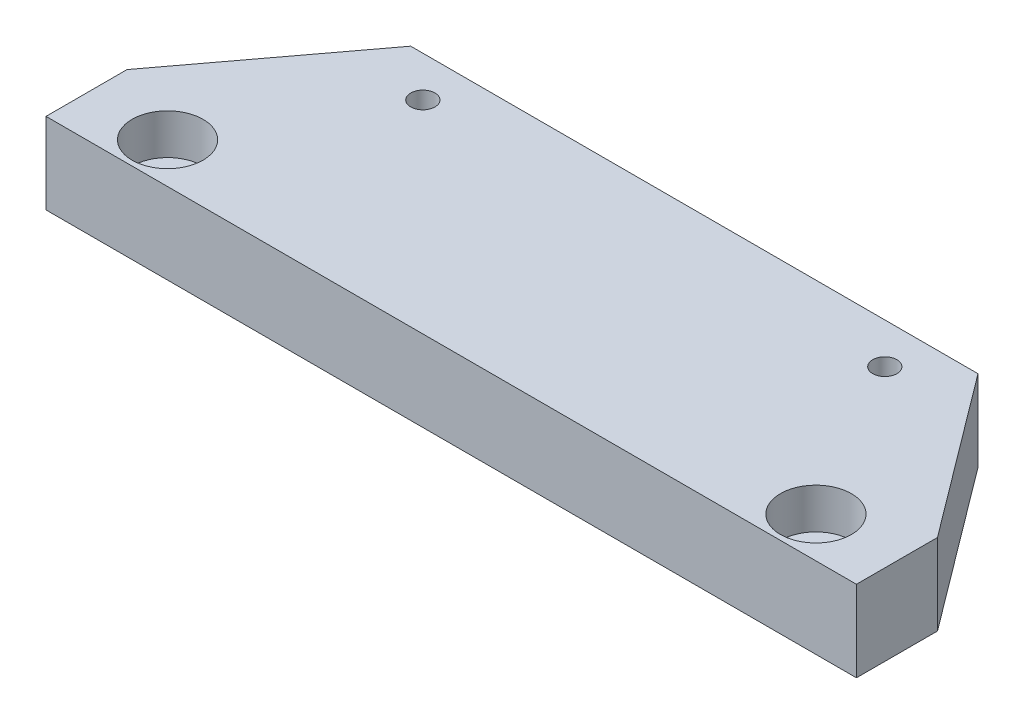
ISO-10303-21;
HEADER;
FILE_DESCRIPTION(('STEP AP214'),'2;1');
FILE_NAME('part.step','',(''),(''),'','','');
FILE_SCHEMA(('AUTOMOTIVE_DESIGN { 1 0 10303 214 1 1 1 1 }'));
ENDSEC;
DATA;
#1=APPLICATION_CONTEXT('core data for automotive mechanical design processes');
#2=APPLICATION_PROTOCOL_DEFINITION('international standard','automotive_design',2000,#1);
#3=PRODUCT_CONTEXT('',#1,'mechanical');
#4=PRODUCT('Part','Part','',(#3));
#5=PRODUCT_RELATED_PRODUCT_CATEGORY('part','',(#4));
#6=PRODUCT_DEFINITION_FORMATION('','',#4);
#7=PRODUCT_DEFINITION_CONTEXT('part definition',#1,'design');
#8=PRODUCT_DEFINITION('design','',#6,#7);
#9=PRODUCT_DEFINITION_SHAPE('','',#8);
#10=(LENGTH_UNIT() NAMED_UNIT(*) SI_UNIT(.MILLI.,.METRE.));
#11=(NAMED_UNIT(*) PLANE_ANGLE_UNIT() SI_UNIT($,.RADIAN.));
#12=(NAMED_UNIT(*) SI_UNIT($,.STERADIAN.) SOLID_ANGLE_UNIT());
#13=UNCERTAINTY_MEASURE_WITH_UNIT(LENGTH_MEASURE(1.E-05),#10,'distance_accuracy_value','');
#14=(GEOMETRIC_REPRESENTATION_CONTEXT(3) GLOBAL_UNCERTAINTY_ASSIGNED_CONTEXT((#13)) GLOBAL_UNIT_ASSIGNED_CONTEXT((#10,
#11,#12)) REPRESENTATION_CONTEXT('',''));
#15=CARTESIAN_POINT('',(0.,0.,0.));
#16=DIRECTION('',(0.,0.,1.));
#17=DIRECTION('',(1.,0.,0.));
#18=AXIS2_PLACEMENT_3D('',#15,#16,#17);
#19=CARTESIAN_POINT('',(56.8959999999999,12.7,-42.672));
#20=DIRECTION('',(0.799999999999999,0.,-0.600000000000001));
#21=DIRECTION('',(-0.600000000000001,0.,-0.8));
#22=AXIS2_PLACEMENT_3D('',#19,#20,#21);
#23=PLANE('',#22);
#24=DIRECTION('',(0.600000000000001,0.,0.8));
#25=VECTOR('',#24,1.);
#26=CARTESIAN_POINT('',(56.8959999999999,0.,-42.672));
#27=LINE('',#26,#25);
#28=CARTESIAN_POINT('',(88.9,0.,0.));
#29=VERTEX_POINT('',#28);
#30=CARTESIAN_POINT('',(107.95,0.,25.4));
#31=VERTEX_POINT('',#30);
#32=EDGE_CURVE('E169',#29,#31,#27,.T.);
#33=ORIENTED_EDGE('',*,*,#32,.F.);
#34=DIRECTION('',(0.,-1.,0.));
#35=VECTOR('',#34,1.);
#36=CARTESIAN_POINT('',(88.9,12.7,0.));
#37=LINE('',#36,#35);
#38=CARTESIAN_POINT('',(88.9,12.7,0.));
#39=VERTEX_POINT('',#38);
#40=EDGE_CURVE('E181',#39,#29,#37,.T.);
#41=ORIENTED_EDGE('',*,*,#40,.F.);
#42=DIRECTION('',(0.600000000000001,0.,0.8));
#43=VECTOR('',#42,1.);
#44=CARTESIAN_POINT('',(56.8959999999999,12.7,-42.672));
#45=LINE('',#44,#43);
#46=CARTESIAN_POINT('',(107.95,12.7,25.4));
#47=VERTEX_POINT('',#46);
#48=EDGE_CURVE('E176',#39,#47,#45,.T.);
#49=ORIENTED_EDGE('',*,*,#48,.T.);
#50=DIRECTION('',(0.,-1.,0.));
#51=VECTOR('',#50,1.);
#52=CARTESIAN_POINT('',(107.95,12.7,25.4));
#53=LINE('',#52,#51);
#54=EDGE_CURVE('E88',#47,#31,#53,.T.);
#55=ORIENTED_EDGE('',*,*,#54,.T.);
#56=EDGE_LOOP('',(#33,#41,#49,#55));
#57=FACE_BOUND('',#56,.T.);
#58=ADVANCED_FACE('F77',(#57),#23,.T.);
#59=CARTESIAN_POINT('',(0.,12.7,0.));
#60=DIRECTION('',(0.8,0.,0.6));
#61=DIRECTION('',(0.6,0.,-0.8));
#62=AXIS2_PLACEMENT_3D('',#59,#60,#61);
#63=PLANE('',#62);
#64=DIRECTION('',(-0.6,0.,0.8));
#65=VECTOR('',#64,1.);
#66=CARTESIAN_POINT('',(0.,0.,0.));
#67=LINE('',#66,#65);
#68=CARTESIAN_POINT('',(0.,0.,0.));
#69=VERTEX_POINT('',#68);
#70=CARTESIAN_POINT('',(-19.05,0.,25.4));
#71=VERTEX_POINT('',#70);
#72=EDGE_CURVE('E167',#69,#71,#67,.T.);
#73=ORIENTED_EDGE('',*,*,#72,.T.);
#74=DIRECTION('',(0.,-1.,0.));
#75=VECTOR('',#74,1.);
#76=CARTESIAN_POINT('',(-19.05,12.7,25.4));
#77=LINE('',#76,#75);
#78=CARTESIAN_POINT('',(-19.05,12.7,25.4));
#79=VERTEX_POINT('',#78);
#80=EDGE_CURVE('E12',#79,#71,#77,.T.);
#81=ORIENTED_EDGE('',*,*,#80,.F.);
#82=DIRECTION('',(-0.6,0.,0.8));
#83=VECTOR('',#82,1.);
#84=CARTESIAN_POINT('',(0.,12.7,0.));
#85=LINE('',#84,#83);
#86=CARTESIAN_POINT('',(0.,12.7,0.));
#87=VERTEX_POINT('',#86);
#88=EDGE_CURVE('E173',#87,#79,#85,.T.);
#89=ORIENTED_EDGE('',*,*,#88,.F.);
#90=DIRECTION('',(0.,-1.,0.));
#91=VECTOR('',#90,1.);
#92=CARTESIAN_POINT('',(0.,12.7,0.));
#93=LINE('',#92,#91);
#94=EDGE_CURVE('E97',#87,#69,#93,.T.);
#95=ORIENTED_EDGE('',*,*,#94,.T.);
#96=EDGE_LOOP('',(#73,#81,#89,#95));
#97=FACE_BOUND('',#96,.T.);
#98=ADVANCED_FACE('F301',(#97),#63,.F.);
#99=CARTESIAN_POINT('',(0.,0.,0.));
#100=DIRECTION('',(0.,1.,0.));
#101=DIRECTION('',(0.,0.,1.));
#102=AXIS2_PLACEMENT_3D('',#99,#100,#101);
#103=PLANE('',#102);
#104=CARTESIAN_POINT('',(-6.34999999999998,0.,31.75));
#105=DIRECTION('',(0.,1.,0.));
#106=DIRECTION('',(0.,0.,1.));
#107=AXIS2_PLACEMENT_3D('',#104,#105,#106);
#108=CIRCLE('',#107,3.3782);
#109=CARTESIAN_POINT('',(-6.34999999999998,0.,35.1282));
#110=VERTEX_POINT('',#109);
#111=EDGE_CURVE('E253',#110,#110,#108,.T.);
#112=ORIENTED_EDGE('',*,*,#111,.T.);
#113=EDGE_LOOP('',(#112));
#114=FACE_BOUND('',#113,.T.);
#115=CARTESIAN_POINT('',(95.25,0.,31.75));
#116=DIRECTION('',(0.,1.,0.));
#117=DIRECTION('',(0.,0.,1.));
#118=AXIS2_PLACEMENT_3D('',#115,#116,#117);
#119=CIRCLE('',#118,3.3782);
#120=CARTESIAN_POINT('',(95.25,0.,35.1282));
#121=VERTEX_POINT('',#120);
#122=EDGE_CURVE('E237',#121,#121,#119,.T.);
#123=ORIENTED_EDGE('',*,*,#122,.T.);
#124=EDGE_LOOP('',(#123));
#125=FACE_BOUND('',#124,.T.);
#126=CARTESIAN_POINT('',(80.645,0.,6.35));
#127=DIRECTION('',(0.,-1.,0.));
#128=DIRECTION('',(0.,0.,-1.));
#129=AXIS2_PLACEMENT_3D('',#126,#127,#128);
#130=CIRCLE('',#129,3.57251);
#131=CARTESIAN_POINT('',(80.645,0.,2.77749));
#132=VERTEX_POINT('',#131);
#133=EDGE_CURVE('E233',#132,#132,#130,.T.);
#134=ORIENTED_EDGE('',*,*,#133,.F.);
#135=EDGE_LOOP('',(#134));
#136=FACE_BOUND('',#135,.T.);
#137=CARTESIAN_POINT('',(8.255,0.,6.35));
#138=DIRECTION('',(0.,-1.,0.));
#139=DIRECTION('',(0.,0.,-1.));
#140=AXIS2_PLACEMENT_3D('',#137,#138,#139);
#141=CIRCLE('',#140,3.57251);
#142=CARTESIAN_POINT('',(8.255,0.,2.77749));
#143=VERTEX_POINT('',#142);
#144=EDGE_CURVE('E217',#143,#143,#141,.T.);
#145=ORIENTED_EDGE('',*,*,#144,.F.);
#146=EDGE_LOOP('',(#145));
#147=FACE_BOUND('',#146,.T.);
#148=DIRECTION('',(1.,0.,0.));
#149=VECTOR('',#148,1.);
#150=CARTESIAN_POINT('',(0.,0.,0.));
#151=LINE('',#150,#149);
#152=EDGE_CURVE('E81',#69,#29,#151,.T.);
#153=ORIENTED_EDGE('',*,*,#152,.T.);
#154=ORIENTED_EDGE('',*,*,#32,.T.);
#155=DIRECTION('',(0.,0.,1.));
#156=VECTOR('',#155,1.);
#157=CARTESIAN_POINT('',(107.95,0.,25.4));
#158=LINE('',#157,#156);
#159=CARTESIAN_POINT('',(107.95,0.,38.1));
#160=VERTEX_POINT('',#159);
#161=EDGE_CURVE('E145',#31,#160,#158,.T.);
#162=ORIENTED_EDGE('',*,*,#161,.T.);
#163=DIRECTION('',(1.,0.,0.));
#164=VECTOR('',#163,1.);
#165=CARTESIAN_POINT('',(-19.05,0.,38.1));
#166=LINE('',#165,#164);
#167=CARTESIAN_POINT('',(-19.05,0.,38.1));
#168=VERTEX_POINT('',#167);
#169=EDGE_CURVE('E149',#168,#160,#166,.T.);
#170=ORIENTED_EDGE('',*,*,#169,.F.);
#171=DIRECTION('',(0.,0.,1.));
#172=VECTOR('',#171,1.);
#173=CARTESIAN_POINT('',(-19.05,0.,25.4));
#174=LINE('',#173,#172);
#175=EDGE_CURVE('E132',#71,#168,#174,.T.);
#176=ORIENTED_EDGE('',*,*,#175,.F.);
#177=ORIENTED_EDGE('',*,*,#72,.F.);
#178=EDGE_LOOP('',(#153,#154,#162,#170,#176,#177));
#179=FACE_BOUND('',#178,.T.);
#180=ADVANCED_FACE('F155',(#114,#125,#136,#147,#179),#103,.F.);
#181=CARTESIAN_POINT('',(0.,12.7,0.));
#182=DIRECTION('',(0.,1.,0.));
#183=DIRECTION('',(0.,0.,1.));
#184=AXIS2_PLACEMENT_3D('',#181,#182,#183);
#185=PLANE('',#184);
#186=CARTESIAN_POINT('',(-6.34999999999998,12.7,31.75));
#187=DIRECTION('',(0.,1.,0.));
#188=DIRECTION('',(0.,0.,1.));
#189=AXIS2_PLACEMENT_3D('',#186,#187,#188);
#190=CIRCLE('',#189,5.55625);
#191=CARTESIAN_POINT('',(-6.34999999999998,12.7,37.30625));
#192=VERTEX_POINT('',#191);
#193=EDGE_CURVE('E265',#192,#192,#190,.T.);
#194=ORIENTED_EDGE('',*,*,#193,.F.);
#195=EDGE_LOOP('',(#194));
#196=FACE_BOUND('',#195,.T.);
#197=CARTESIAN_POINT('',(95.25,12.7,31.75));
#198=DIRECTION('',(0.,1.,0.));
#199=DIRECTION('',(0.,0.,1.));
#200=AXIS2_PLACEMENT_3D('',#197,#198,#199);
#201=CIRCLE('',#200,5.55625);
#202=CARTESIAN_POINT('',(95.25,12.7,37.30625));
#203=VERTEX_POINT('',#202);
#204=EDGE_CURVE('E249',#203,#203,#201,.T.);
#205=ORIENTED_EDGE('',*,*,#204,.F.);
#206=EDGE_LOOP('',(#205));
#207=FACE_BOUND('',#206,.T.);
#208=CARTESIAN_POINT('',(80.645,12.7,6.35));
#209=DIRECTION('',(0.,1.,0.));
#210=DIRECTION('',(0.,0.,1.));
#211=AXIS2_PLACEMENT_3D('',#208,#209,#210);
#212=CIRCLE('',#211,1.89865);
#213=CARTESIAN_POINT('',(80.645,12.7,8.24865));
#214=VERTEX_POINT('',#213);
#215=EDGE_CURVE('E221',#214,#214,#212,.T.);
#216=ORIENTED_EDGE('',*,*,#215,.F.);
#217=EDGE_LOOP('',(#216));
#218=FACE_BOUND('',#217,.T.);
#219=CARTESIAN_POINT('',(8.255,12.7,6.35));
#220=DIRECTION('',(0.,1.,0.));
#221=DIRECTION('',(0.,0.,1.));
#222=AXIS2_PLACEMENT_3D('',#219,#220,#221);
#223=CIRCLE('',#222,1.89865);
#224=CARTESIAN_POINT('',(8.255,12.7,8.24865));
#225=VERTEX_POINT('',#224);
#226=EDGE_CURVE('E205',#225,#225,#223,.T.);
#227=ORIENTED_EDGE('',*,*,#226,.F.);
#228=EDGE_LOOP('',(#227));
#229=FACE_BOUND('',#228,.T.);
#230=ORIENTED_EDGE('',*,*,#48,.F.);
#231=DIRECTION('',(1.,0.,0.));
#232=VECTOR('',#231,1.);
#233=CARTESIAN_POINT('',(0.,12.7,0.));
#234=LINE('',#233,#232);
#235=EDGE_CURVE('E158',#87,#39,#234,.T.);
#236=ORIENTED_EDGE('',*,*,#235,.F.);
#237=ORIENTED_EDGE('',*,*,#88,.T.);
#238=DIRECTION('',(0.,0.,1.));
#239=VECTOR('',#238,1.);
#240=CARTESIAN_POINT('',(-19.05,12.7,25.4));
#241=LINE('',#240,#239);
#242=CARTESIAN_POINT('',(-19.05,12.7,38.1));
#243=VERTEX_POINT('',#242);
#244=EDGE_CURVE('E152',#79,#243,#241,.T.);
#245=ORIENTED_EDGE('',*,*,#244,.T.);
#246=DIRECTION('',(1.,0.,0.));
#247=VECTOR('',#246,1.);
#248=CARTESIAN_POINT('',(-19.05,12.7,38.1));
#249=LINE('',#248,#247);
#250=CARTESIAN_POINT('',(107.95,12.7,38.1));
#251=VERTEX_POINT('',#250);
#252=EDGE_CURVE('E144',#243,#251,#249,.T.);
#253=ORIENTED_EDGE('',*,*,#252,.T.);
#254=DIRECTION('',(0.,0.,1.));
#255=VECTOR('',#254,1.);
#256=CARTESIAN_POINT('',(107.95,12.7,25.4));
#257=LINE('',#256,#255);
#258=EDGE_CURVE('E187',#47,#251,#257,.T.);
#259=ORIENTED_EDGE('',*,*,#258,.F.);
#260=EDGE_LOOP('',(#230,#236,#237,#245,#253,#259));
#261=FACE_BOUND('',#260,.T.);
#262=ADVANCED_FACE('F195',(#196,#207,#218,#229,#261),#185,.T.);
#263=CARTESIAN_POINT('',(0.,12.7,0.));
#264=DIRECTION('',(0.,0.,-1.));
#265=DIRECTION('',(-1.,0.,0.));
#266=AXIS2_PLACEMENT_3D('',#263,#264,#265);
#267=PLANE('',#266);
#268=ORIENTED_EDGE('',*,*,#152,.F.);
#269=ORIENTED_EDGE('',*,*,#94,.F.);
#270=ORIENTED_EDGE('',*,*,#235,.T.);
#271=ORIENTED_EDGE('',*,*,#40,.T.);
#272=EDGE_LOOP('',(#268,#269,#270,#271));
#273=FACE_BOUND('',#272,.T.);
#274=ADVANCED_FACE('F79',(#273),#267,.T.);
#275=CARTESIAN_POINT('',(107.95,12.7,25.4));
#276=DIRECTION('',(1.,0.,0.));
#277=DIRECTION('',(0.,0.,-1.));
#278=AXIS2_PLACEMENT_3D('',#275,#276,#277);
#279=PLANE('',#278);
#280=ORIENTED_EDGE('',*,*,#161,.F.);
#281=ORIENTED_EDGE('',*,*,#54,.F.);
#282=ORIENTED_EDGE('',*,*,#258,.T.);
#283=DIRECTION('',(0.,-1.,0.));
#284=VECTOR('',#283,1.);
#285=CARTESIAN_POINT('',(107.95,12.7,38.1));
#286=LINE('',#285,#284);
#287=EDGE_CURVE('E126',#251,#160,#286,.T.);
#288=ORIENTED_EDGE('',*,*,#287,.T.);
#289=EDGE_LOOP('',(#280,#281,#282,#288));
#290=FACE_BOUND('',#289,.T.);
#291=ADVANCED_FACE('F198',(#290),#279,.T.);
#292=CARTESIAN_POINT('',(-19.05,12.7,38.1));
#293=DIRECTION('',(0.,0.,-1.));
#294=DIRECTION('',(-1.,0.,0.));
#295=AXIS2_PLACEMENT_3D('',#292,#293,#294);
#296=PLANE('',#295);
#297=ORIENTED_EDGE('',*,*,#169,.T.);
#298=ORIENTED_EDGE('',*,*,#287,.F.);
#299=ORIENTED_EDGE('',*,*,#252,.F.);
#300=DIRECTION('',(0.,-1.,0.));
#301=VECTOR('',#300,1.);
#302=CARTESIAN_POINT('',(-19.05,12.7,38.1));
#303=LINE('',#302,#301);
#304=EDGE_CURVE('E136',#243,#168,#303,.T.);
#305=ORIENTED_EDGE('',*,*,#304,.T.);
#306=EDGE_LOOP('',(#297,#298,#299,#305));
#307=FACE_BOUND('',#306,.T.);
#308=ADVANCED_FACE('F148',(#307),#296,.F.);
#309=CARTESIAN_POINT('',(-19.05,12.7,25.4));
#310=DIRECTION('',(1.,0.,0.));
#311=DIRECTION('',(0.,0.,-1.));
#312=AXIS2_PLACEMENT_3D('',#309,#310,#311);
#313=PLANE('',#312);
#314=ORIENTED_EDGE('',*,*,#175,.T.);
#315=ORIENTED_EDGE('',*,*,#304,.F.);
#316=ORIENTED_EDGE('',*,*,#244,.F.);
#317=ORIENTED_EDGE('',*,*,#80,.T.);
#318=EDGE_LOOP('',(#314,#315,#316,#317));
#319=FACE_BOUND('',#318,.T.);
#320=ADVANCED_FACE('F134',(#319),#313,.F.);
#321=CARTESIAN_POINT('',(8.255,0.,6.35));
#322=DIRECTION('',(0.,-1.,0.));
#323=DIRECTION('',(0.,0.,-1.));
#324=AXIS2_PLACEMENT_3D('',#321,#322,#323);
#325=CYLINDRICAL_SURFACE('',#324,1.89865);
#326=CARTESIAN_POINT('',(8.255,3.5052,6.35));
#327=DIRECTION('',(0.,-1.,0.));
#328=DIRECTION('',(0.,0.,-1.));
#329=AXIS2_PLACEMENT_3D('',#326,#327,#328);
#330=CIRCLE('',#329,1.89865);
#331=CARTESIAN_POINT('',(8.255,3.5052,4.45135));
#332=VERTEX_POINT('',#331);
#333=EDGE_CURVE('E209',#332,#332,#330,.T.);
#334=ORIENTED_EDGE('',*,*,#333,.T.);
#335=EDGE_LOOP('',(#334));
#336=FACE_BOUND('',#335,.T.);
#337=ORIENTED_EDGE('',*,*,#226,.T.);
#338=EDGE_LOOP('',(#337));
#339=FACE_BOUND('',#338,.T.);
#340=ADVANCED_FACE('F281',(#336,#339),#325,.F.);
#341=CARTESIAN_POINT('',(10.15365,3.5052,6.35));
#342=DIRECTION('',(0.,1.,0.));
#343=DIRECTION('',(0.,0.,1.));
#344=AXIS2_PLACEMENT_3D('',#341,#342,#343);
#345=PLANE('',#344);
#346=ORIENTED_EDGE('',*,*,#333,.F.);
#347=EDGE_LOOP('',(#346));
#348=FACE_BOUND('',#347,.T.);
#349=CARTESIAN_POINT('',(8.255,3.5052,6.35));
#350=DIRECTION('',(0.,-1.,0.));
#351=DIRECTION('',(0.,0.,-1.));
#352=AXIS2_PLACEMENT_3D('',#349,#350,#351);
#353=CIRCLE('',#352,3.57251);
#354=CARTESIAN_POINT('',(8.255,3.5052,2.77749));
#355=VERTEX_POINT('',#354);
#356=EDGE_CURVE('E213',#355,#355,#353,.T.);
#357=ORIENTED_EDGE('',*,*,#356,.T.);
#358=EDGE_LOOP('',(#357));
#359=FACE_BOUND('',#358,.T.);
#360=ADVANCED_FACE('F283',(#348,#359),#345,.F.);
#361=CARTESIAN_POINT('',(8.255,0.,6.35));
#362=DIRECTION('',(0.,-1.,0.));
#363=DIRECTION('',(0.,0.,-1.));
#364=AXIS2_PLACEMENT_3D('',#361,#362,#363);
#365=CYLINDRICAL_SURFACE('',#364,3.57251);
#366=ORIENTED_EDGE('',*,*,#356,.F.);
#367=EDGE_LOOP('',(#366));
#368=FACE_BOUND('',#367,.T.);
#369=ORIENTED_EDGE('',*,*,#144,.T.);
#370=EDGE_LOOP('',(#369));
#371=FACE_BOUND('',#370,.T.);
#372=ADVANCED_FACE('F290',(#368,#371),#365,.F.);
#373=CARTESIAN_POINT('',(80.645,0.,6.35));
#374=DIRECTION('',(0.,-1.,0.));
#375=DIRECTION('',(0.,0.,-1.));
#376=AXIS2_PLACEMENT_3D('',#373,#374,#375);
#377=CYLINDRICAL_SURFACE('',#376,1.89865);
#378=CARTESIAN_POINT('',(80.645,3.5052,6.35));
#379=DIRECTION('',(0.,-1.,0.));
#380=DIRECTION('',(0.,0.,-1.));
#381=AXIS2_PLACEMENT_3D('',#378,#379,#380);
#382=CIRCLE('',#381,1.89865);
#383=CARTESIAN_POINT('',(80.645,3.5052,4.45135));
#384=VERTEX_POINT('',#383);
#385=EDGE_CURVE('E225',#384,#384,#382,.T.);
#386=ORIENTED_EDGE('',*,*,#385,.T.);
#387=EDGE_LOOP('',(#386));
#388=FACE_BOUND('',#387,.T.);
#389=ORIENTED_EDGE('',*,*,#215,.T.);
#390=EDGE_LOOP('',(#389));
#391=FACE_BOUND('',#390,.T.);
#392=ADVANCED_FACE('F337',(#388,#391),#377,.F.);
#393=CARTESIAN_POINT('',(82.54365,3.5052,6.35));
#394=DIRECTION('',(0.,1.,0.));
#395=DIRECTION('',(0.,0.,1.));
#396=AXIS2_PLACEMENT_3D('',#393,#394,#395);
#397=PLANE('',#396);
#398=ORIENTED_EDGE('',*,*,#385,.F.);
#399=EDGE_LOOP('',(#398));
#400=FACE_BOUND('',#399,.T.);
#401=CARTESIAN_POINT('',(80.645,3.5052,6.35));
#402=DIRECTION('',(0.,-1.,0.));
#403=DIRECTION('',(0.,0.,-1.));
#404=AXIS2_PLACEMENT_3D('',#401,#402,#403);
#405=CIRCLE('',#404,3.57251);
#406=CARTESIAN_POINT('',(80.645,3.5052,2.77749));
#407=VERTEX_POINT('',#406);
#408=EDGE_CURVE('E229',#407,#407,#405,.T.);
#409=ORIENTED_EDGE('',*,*,#408,.T.);
#410=EDGE_LOOP('',(#409));
#411=FACE_BOUND('',#410,.T.);
#412=ADVANCED_FACE('F347',(#400,#411),#397,.F.);
#413=CARTESIAN_POINT('',(80.645,0.,6.35));
#414=DIRECTION('',(0.,-1.,0.));
#415=DIRECTION('',(0.,0.,-1.));
#416=AXIS2_PLACEMENT_3D('',#413,#414,#415);
#417=CYLINDRICAL_SURFACE('',#416,3.57251);
#418=ORIENTED_EDGE('',*,*,#408,.F.);
#419=EDGE_LOOP('',(#418));
#420=FACE_BOUND('',#419,.T.);
#421=ORIENTED_EDGE('',*,*,#133,.T.);
#422=EDGE_LOOP('',(#421));
#423=FACE_BOUND('',#422,.T.);
#424=ADVANCED_FACE('F357',(#420,#423),#417,.F.);
#425=CARTESIAN_POINT('',(95.25,12.7,31.75));
#426=DIRECTION('',(0.,1.,0.));
#427=DIRECTION('',(0.,0.,1.));
#428=AXIS2_PLACEMENT_3D('',#425,#426,#427);
#429=CYLINDRICAL_SURFACE('',#428,3.3782);
#430=ORIENTED_EDGE('',*,*,#122,.F.);
#431=EDGE_LOOP('',(#430));
#432=FACE_BOUND('',#431,.T.);
#433=CARTESIAN_POINT('',(95.25,6.35,31.75));
#434=DIRECTION('',(0.,1.,0.));
#435=DIRECTION('',(0.,0.,1.));
#436=AXIS2_PLACEMENT_3D('',#433,#434,#435);
#437=CIRCLE('',#436,3.3782);
#438=CARTESIAN_POINT('',(95.25,6.35,35.1282));
#439=VERTEX_POINT('',#438);
#440=EDGE_CURVE('E241',#439,#439,#437,.T.);
#441=ORIENTED_EDGE('',*,*,#440,.T.);
#442=EDGE_LOOP('',(#441));
#443=FACE_BOUND('',#442,.T.);
#444=ADVANCED_FACE('F367',(#432,#443),#429,.F.);
#445=CARTESIAN_POINT('',(98.6282,6.35,31.75));
#446=DIRECTION('',(0.,-1.,0.));
#447=DIRECTION('',(0.,0.,-1.));
#448=AXIS2_PLACEMENT_3D('',#445,#446,#447);
#449=PLANE('',#448);
#450=ORIENTED_EDGE('',*,*,#440,.F.);
#451=EDGE_LOOP('',(#450));
#452=FACE_BOUND('',#451,.T.);
#453=CARTESIAN_POINT('',(95.25,6.35,31.75));
#454=DIRECTION('',(0.,1.,0.));
#455=DIRECTION('',(0.,0.,1.));
#456=AXIS2_PLACEMENT_3D('',#453,#454,#455);
#457=CIRCLE('',#456,5.55625);
#458=CARTESIAN_POINT('',(95.25,6.35,37.30625));
#459=VERTEX_POINT('',#458);
#460=EDGE_CURVE('E245',#459,#459,#457,.T.);
#461=ORIENTED_EDGE('',*,*,#460,.T.);
#462=EDGE_LOOP('',(#461));
#463=FACE_BOUND('',#462,.T.);
#464=ADVANCED_FACE('F378',(#452,#463),#449,.F.);
#465=CARTESIAN_POINT('',(95.25,12.7,31.75));
#466=DIRECTION('',(0.,1.,0.));
#467=DIRECTION('',(0.,0.,1.));
#468=AXIS2_PLACEMENT_3D('',#465,#466,#467);
#469=CYLINDRICAL_SURFACE('',#468,5.55625);
#470=ORIENTED_EDGE('',*,*,#460,.F.);
#471=EDGE_LOOP('',(#470));
#472=FACE_BOUND('',#471,.T.);
#473=ORIENTED_EDGE('',*,*,#204,.T.);
#474=EDGE_LOOP('',(#473));
#475=FACE_BOUND('',#474,.T.);
#476=ADVANCED_FACE('F388',(#472,#475),#469,.F.);
#477=CARTESIAN_POINT('',(-6.34999999999998,12.7,31.75));
#478=DIRECTION('',(0.,1.,0.));
#479=DIRECTION('',(0.,0.,1.));
#480=AXIS2_PLACEMENT_3D('',#477,#478,#479);
#481=CYLINDRICAL_SURFACE('',#480,3.3782);
#482=ORIENTED_EDGE('',*,*,#111,.F.);
#483=EDGE_LOOP('',(#482));
#484=FACE_BOUND('',#483,.T.);
#485=CARTESIAN_POINT('',(-6.34999999999998,6.35,31.75));
#486=DIRECTION('',(0.,1.,0.));
#487=DIRECTION('',(0.,0.,1.));
#488=AXIS2_PLACEMENT_3D('',#485,#486,#487);
#489=CIRCLE('',#488,3.3782);
#490=CARTESIAN_POINT('',(-6.34999999999998,6.35,35.1282));
#491=VERTEX_POINT('',#490);
#492=EDGE_CURVE('E257',#491,#491,#489,.T.);
#493=ORIENTED_EDGE('',*,*,#492,.T.);
#494=EDGE_LOOP('',(#493));
#495=FACE_BOUND('',#494,.T.);
#496=ADVANCED_FACE('F398',(#484,#495),#481,.F.);
#497=CARTESIAN_POINT('',(-2.97179999999998,6.35,31.75));
#498=DIRECTION('',(0.,-1.,0.));
#499=DIRECTION('',(0.,0.,-1.));
#500=AXIS2_PLACEMENT_3D('',#497,#498,#499);
#501=PLANE('',#500);
#502=ORIENTED_EDGE('',*,*,#492,.F.);
#503=EDGE_LOOP('',(#502));
#504=FACE_BOUND('',#503,.T.);
#505=CARTESIAN_POINT('',(-6.34999999999998,6.35,31.75));
#506=DIRECTION('',(0.,1.,0.));
#507=DIRECTION('',(0.,0.,1.));
#508=AXIS2_PLACEMENT_3D('',#505,#506,#507);
#509=CIRCLE('',#508,5.55625);
#510=CARTESIAN_POINT('',(-6.34999999999998,6.35,37.30625));
#511=VERTEX_POINT('',#510);
#512=EDGE_CURVE('E261',#511,#511,#509,.T.);
#513=ORIENTED_EDGE('',*,*,#512,.T.);
#514=EDGE_LOOP('',(#513));
#515=FACE_BOUND('',#514,.T.);
#516=ADVANCED_FACE('F408',(#504,#515),#501,.F.);
#517=CARTESIAN_POINT('',(-6.34999999999998,12.7,31.75));
#518=DIRECTION('',(0.,1.,0.));
#519=DIRECTION('',(0.,0.,1.));
#520=AXIS2_PLACEMENT_3D('',#517,#518,#519);
#521=CYLINDRICAL_SURFACE('',#520,5.55625);
#522=ORIENTED_EDGE('',*,*,#512,.F.);
#523=EDGE_LOOP('',(#522));
#524=FACE_BOUND('',#523,.T.);
#525=ORIENTED_EDGE('',*,*,#193,.T.);
#526=EDGE_LOOP('',(#525));
#527=FACE_BOUND('',#526,.T.);
#528=ADVANCED_FACE('F270',(#524,#527),#521,.F.);
#529=CLOSED_SHELL('',(#58,#98,#180,#262,#274,#291,#308,#320,#340,#360,#372,#392,#412,#424,#444,
#464,#476,#496,#516,#528));
#530=MANIFOLD_SOLID_BREP('B2',#529);
#531=ADVANCED_BREP_SHAPE_REPRESENTATION('',(#18,#530),#14);
#532=SHAPE_DEFINITION_REPRESENTATION(#9,#531);
ENDSEC;
END-ISO-10303-21;
